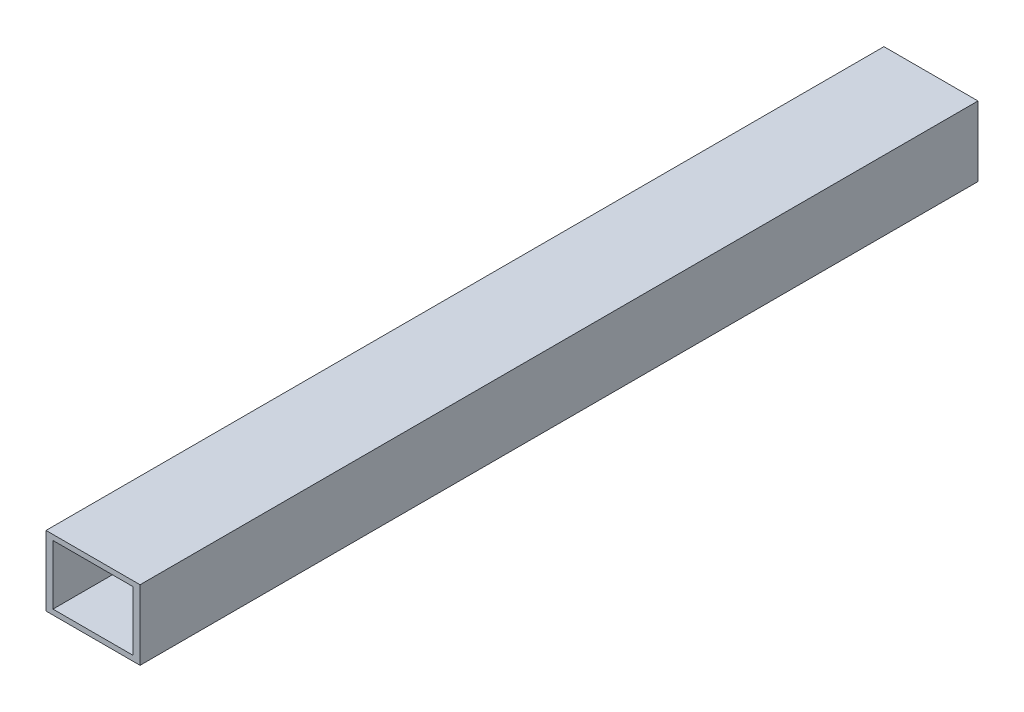
ISO-10303-21;
HEADER;
FILE_DESCRIPTION(('STEP AP214'),'2;1');
FILE_NAME('part.step','',(''),(''),'','','');
FILE_SCHEMA(('AUTOMOTIVE_DESIGN { 1 0 10303 214 1 1 1 1 }'));
ENDSEC;
DATA;
#1=APPLICATION_CONTEXT('core data for automotive mechanical design processes');
#2=APPLICATION_PROTOCOL_DEFINITION('international standard','automotive_design',2000,#1);
#3=PRODUCT_CONTEXT('',#1,'mechanical');
#4=PRODUCT('Part','Part','',(#3));
#5=PRODUCT_RELATED_PRODUCT_CATEGORY('part','',(#4));
#6=PRODUCT_DEFINITION_FORMATION('','',#4);
#7=PRODUCT_DEFINITION_CONTEXT('part definition',#1,'design');
#8=PRODUCT_DEFINITION('design','',#6,#7);
#9=PRODUCT_DEFINITION_SHAPE('','',#8);
#10=(LENGTH_UNIT() NAMED_UNIT(*) SI_UNIT(.MILLI.,.METRE.));
#11=(NAMED_UNIT(*) PLANE_ANGLE_UNIT() SI_UNIT($,.RADIAN.));
#12=(NAMED_UNIT(*) SI_UNIT($,.STERADIAN.) SOLID_ANGLE_UNIT());
#13=UNCERTAINTY_MEASURE_WITH_UNIT(LENGTH_MEASURE(1.E-05),#10,'distance_accuracy_value','');
#14=(GEOMETRIC_REPRESENTATION_CONTEXT(3) GLOBAL_UNCERTAINTY_ASSIGNED_CONTEXT((#13)) GLOBAL_UNIT_ASSIGNED_CONTEXT((#10,
#11,#12)) REPRESENTATION_CONTEXT('',''));
#15=CARTESIAN_POINT('',(0.,0.,0.));
#16=DIRECTION('',(0.,0.,1.));
#17=DIRECTION('',(1.,0.,0.));
#18=AXIS2_PLACEMENT_3D('',#15,#16,#17);
#19=CARTESIAN_POINT('',(0.,0.,609.6));
#20=DIRECTION('',(0.,0.,-1.));
#21=DIRECTION('',(-1.,0.,0.));
#22=AXIS2_PLACEMENT_3D('',#19,#20,#21);
#23=PLANE('',#22);
#24=DIRECTION('',(0.,1.,0.));
#25=VECTOR('',#24,1.);
#26=CARTESIAN_POINT('',(34.2141182707811,-25.4,609.6));
#27=LINE('',#26,#25);
#28=CARTESIAN_POINT('',(34.2141182707811,-25.4,609.6));
#29=VERTEX_POINT('',#28);
#30=CARTESIAN_POINT('',(34.2141182707811,25.4,609.6));
#31=VERTEX_POINT('',#30);
#32=EDGE_CURVE('E134',#29,#31,#27,.T.);
#33=ORIENTED_EDGE('',*,*,#32,.T.);
#34=DIRECTION('',(-1.,0.,0.));
#35=VECTOR('',#34,1.);
#36=CARTESIAN_POINT('',(-34.2141182707811,25.4,609.6));
#37=LINE('',#36,#35);
#38=CARTESIAN_POINT('',(-34.2141182707811,25.4,609.6));
#39=VERTEX_POINT('',#38);
#40=EDGE_CURVE('E137',#31,#39,#37,.T.);
#41=ORIENTED_EDGE('',*,*,#40,.T.);
#42=DIRECTION('',(0.,-1.,0.));
#43=VECTOR('',#42,1.);
#44=CARTESIAN_POINT('',(-34.2141182707811,-25.4,609.6));
#45=LINE('',#44,#43);
#46=CARTESIAN_POINT('',(-34.2141182707811,-25.4,609.6));
#47=VERTEX_POINT('',#46);
#48=EDGE_CURVE('E140',#39,#47,#45,.T.);
#49=ORIENTED_EDGE('',*,*,#48,.T.);
#50=DIRECTION('',(1.,0.,0.));
#51=VECTOR('',#50,1.);
#52=CARTESIAN_POINT('',(-34.2141182707811,-25.4,609.6));
#53=LINE('',#52,#51);
#54=EDGE_CURVE('E142',#47,#29,#53,.T.);
#55=ORIENTED_EDGE('',*,*,#54,.T.);
#56=EDGE_LOOP('',(#33,#41,#49,#55));
#57=FACE_BOUND('',#56,.T.);
#58=DIRECTION('',(0.,1.,0.));
#59=VECTOR('',#58,1.);
#60=CARTESIAN_POINT('',(29.1341182707811,-21.6286913554574,609.6));
#61=LINE('',#60,#59);
#62=CARTESIAN_POINT('',(29.1341182707811,-21.6286913554574,609.6));
#63=VERTEX_POINT('',#62);
#64=CARTESIAN_POINT('',(29.1341182707811,21.6286913554574,609.6));
#65=VERTEX_POINT('',#64);
#66=EDGE_CURVE('E98',#63,#65,#61,.T.);
#67=ORIENTED_EDGE('',*,*,#66,.F.);
#68=DIRECTION('',(1.,0.,0.));
#69=VECTOR('',#68,1.);
#70=CARTESIAN_POINT('',(-29.1341182707811,-21.6286913554574,609.6));
#71=LINE('',#70,#69);
#72=CARTESIAN_POINT('',(-29.1341182707811,-21.6286913554574,609.6));
#73=VERTEX_POINT('',#72);
#74=EDGE_CURVE('E120',#73,#63,#71,.T.);
#75=ORIENTED_EDGE('',*,*,#74,.F.);
#76=DIRECTION('',(0.,-1.,0.));
#77=VECTOR('',#76,1.);
#78=CARTESIAN_POINT('',(-29.1341182707811,-21.6286913554574,609.6));
#79=LINE('',#78,#77);
#80=CARTESIAN_POINT('',(-29.1341182707811,21.6286913554574,609.6));
#81=VERTEX_POINT('',#80);
#82=EDGE_CURVE('E118',#81,#73,#79,.T.);
#83=ORIENTED_EDGE('',*,*,#82,.F.);
#84=DIRECTION('',(-1.,0.,0.));
#85=VECTOR('',#84,1.);
#86=CARTESIAN_POINT('',(-29.1341182707811,21.6286913554574,609.6));
#87=LINE('',#86,#85);
#88=EDGE_CURVE('E106',#65,#81,#87,.T.);
#89=ORIENTED_EDGE('',*,*,#88,.F.);
#90=EDGE_LOOP('',(#67,#75,#83,#89));
#91=FACE_BOUND('',#90,.T.);
#92=ADVANCED_FACE('F33',(#57,#91),#23,.F.);
#93=CARTESIAN_POINT('',(0.,0.,0.));
#94=DIRECTION('',(0.,0.,-1.));
#95=DIRECTION('',(-1.,0.,0.));
#96=AXIS2_PLACEMENT_3D('',#93,#94,#95);
#97=PLANE('',#96);
#98=DIRECTION('',(0.,1.,0.));
#99=VECTOR('',#98,1.);
#100=CARTESIAN_POINT('',(34.2141182707811,-25.4,0.));
#101=LINE('',#100,#99);
#102=CARTESIAN_POINT('',(34.2141182707811,-25.4,0.));
#103=VERTEX_POINT('',#102);
#104=CARTESIAN_POINT('',(34.2141182707811,25.4,0.));
#105=VERTEX_POINT('',#104);
#106=EDGE_CURVE('E114',#103,#105,#101,.T.);
#107=ORIENTED_EDGE('',*,*,#106,.F.);
#108=DIRECTION('',(1.,0.,0.));
#109=VECTOR('',#108,1.);
#110=CARTESIAN_POINT('',(-34.2141182707811,-25.4,0.));
#111=LINE('',#110,#109);
#112=CARTESIAN_POINT('',(-34.2141182707811,-25.4,0.));
#113=VERTEX_POINT('',#112);
#114=EDGE_CURVE('E138',#113,#103,#111,.T.);
#115=ORIENTED_EDGE('',*,*,#114,.F.);
#116=DIRECTION('',(0.,-1.,0.));
#117=VECTOR('',#116,1.);
#118=CARTESIAN_POINT('',(-34.2141182707811,-25.4,0.));
#119=LINE('',#118,#117);
#120=CARTESIAN_POINT('',(-34.2141182707811,25.4,0.));
#121=VERTEX_POINT('',#120);
#122=EDGE_CURVE('E149',#121,#113,#119,.T.);
#123=ORIENTED_EDGE('',*,*,#122,.F.);
#124=DIRECTION('',(-1.,0.,0.));
#125=VECTOR('',#124,1.);
#126=CARTESIAN_POINT('',(-34.2141182707811,25.4,0.));
#127=LINE('',#126,#125);
#128=EDGE_CURVE('E147',#105,#121,#127,.T.);
#129=ORIENTED_EDGE('',*,*,#128,.F.);
#130=EDGE_LOOP('',(#107,#115,#123,#129));
#131=FACE_BOUND('',#130,.T.);
#132=DIRECTION('',(1.,0.,0.));
#133=VECTOR('',#132,1.);
#134=CARTESIAN_POINT('',(-29.1341182707811,-21.6286913554574,0.));
#135=LINE('',#134,#133);
#136=CARTESIAN_POINT('',(-29.1341182707811,-21.6286913554574,0.));
#137=VERTEX_POINT('',#136);
#138=CARTESIAN_POINT('',(29.1341182707811,-21.6286913554574,0.));
#139=VERTEX_POINT('',#138);
#140=EDGE_CURVE('E107',#137,#139,#135,.T.);
#141=ORIENTED_EDGE('',*,*,#140,.T.);
#142=DIRECTION('',(0.,1.,0.));
#143=VECTOR('',#142,1.);
#144=CARTESIAN_POINT('',(29.1341182707811,-21.6286913554574,0.));
#145=LINE('',#144,#143);
#146=CARTESIAN_POINT('',(29.1341182707811,21.6286913554574,0.));
#147=VERTEX_POINT('',#146);
#148=EDGE_CURVE('E56',#139,#147,#145,.T.);
#149=ORIENTED_EDGE('',*,*,#148,.T.);
#150=DIRECTION('',(-1.,0.,0.));
#151=VECTOR('',#150,1.);
#152=CARTESIAN_POINT('',(-29.1341182707811,21.6286913554574,0.));
#153=LINE('',#152,#151);
#154=CARTESIAN_POINT('',(-29.1341182707811,21.6286913554574,0.));
#155=VERTEX_POINT('',#154);
#156=EDGE_CURVE('E113',#147,#155,#153,.T.);
#157=ORIENTED_EDGE('',*,*,#156,.T.);
#158=DIRECTION('',(0.,-1.,0.));
#159=VECTOR('',#158,1.);
#160=CARTESIAN_POINT('',(-29.1341182707811,-21.6286913554574,0.));
#161=LINE('',#160,#159);
#162=EDGE_CURVE('E126',#155,#137,#161,.T.);
#163=ORIENTED_EDGE('',*,*,#162,.T.);
#164=EDGE_LOOP('',(#141,#149,#157,#163));
#165=FACE_BOUND('',#164,.T.);
#166=ADVANCED_FACE('F167',(#131,#165),#97,.T.);
#167=CARTESIAN_POINT('',(34.2141182707811,-25.4,609.6));
#168=DIRECTION('',(-1.,0.,0.));
#169=DIRECTION('',(0.,0.,1.));
#170=AXIS2_PLACEMENT_3D('',#167,#168,#169);
#171=PLANE('',#170);
#172=ORIENTED_EDGE('',*,*,#106,.T.);
#173=DIRECTION('',(0.,0.,-1.));
#174=VECTOR('',#173,1.);
#175=CARTESIAN_POINT('',(34.2141182707811,25.4,609.6));
#176=LINE('',#175,#174);
#177=EDGE_CURVE('E11',#31,#105,#176,.T.);
#178=ORIENTED_EDGE('',*,*,#177,.F.);
#179=ORIENTED_EDGE('',*,*,#32,.F.);
#180=DIRECTION('',(0.,0.,-1.));
#181=VECTOR('',#180,1.);
#182=CARTESIAN_POINT('',(34.2141182707811,-25.4,609.6));
#183=LINE('',#182,#181);
#184=EDGE_CURVE('E144',#29,#103,#183,.T.);
#185=ORIENTED_EDGE('',*,*,#184,.T.);
#186=EDGE_LOOP('',(#172,#178,#179,#185));
#187=FACE_BOUND('',#186,.T.);
#188=ADVANCED_FACE('F35',(#187),#171,.F.);
#189=CARTESIAN_POINT('',(-34.2141182707811,25.4,609.6));
#190=DIRECTION('',(0.,-1.,0.));
#191=DIRECTION('',(0.,0.,-1.));
#192=AXIS2_PLACEMENT_3D('',#189,#190,#191);
#193=PLANE('',#192);
#194=ORIENTED_EDGE('',*,*,#128,.T.);
#195=DIRECTION('',(0.,0.,-1.));
#196=VECTOR('',#195,1.);
#197=CARTESIAN_POINT('',(-34.2141182707811,25.4,609.6));
#198=LINE('',#197,#196);
#199=EDGE_CURVE('E41',#39,#121,#198,.T.);
#200=ORIENTED_EDGE('',*,*,#199,.F.);
#201=ORIENTED_EDGE('',*,*,#40,.F.);
#202=ORIENTED_EDGE('',*,*,#177,.T.);
#203=EDGE_LOOP('',(#194,#200,#201,#202));
#204=FACE_BOUND('',#203,.T.);
#205=ADVANCED_FACE('F177',(#204),#193,.F.);
#206=CARTESIAN_POINT('',(-34.2141182707811,-25.4,609.6));
#207=DIRECTION('',(1.,0.,0.));
#208=DIRECTION('',(0.,1.,0.));
#209=AXIS2_PLACEMENT_3D('',#206,#207,#208);
#210=PLANE('',#209);
#211=ORIENTED_EDGE('',*,*,#122,.T.);
#212=DIRECTION('',(0.,0.,-1.));
#213=VECTOR('',#212,1.);
#214=CARTESIAN_POINT('',(-34.2141182707811,-25.4,609.6));
#215=LINE('',#214,#213);
#216=EDGE_CURVE('E154',#47,#113,#215,.T.);
#217=ORIENTED_EDGE('',*,*,#216,.F.);
#218=ORIENTED_EDGE('',*,*,#48,.F.);
#219=ORIENTED_EDGE('',*,*,#199,.T.);
#220=EDGE_LOOP('',(#211,#217,#218,#219));
#221=FACE_BOUND('',#220,.T.);
#222=ADVANCED_FACE('F161',(#221),#210,.F.);
#223=CARTESIAN_POINT('',(-34.2141182707811,-25.4,609.6));
#224=DIRECTION('',(0.,1.,0.));
#225=DIRECTION('',(0.,0.,1.));
#226=AXIS2_PLACEMENT_3D('',#223,#224,#225);
#227=PLANE('',#226);
#228=ORIENTED_EDGE('',*,*,#114,.T.);
#229=ORIENTED_EDGE('',*,*,#184,.F.);
#230=ORIENTED_EDGE('',*,*,#54,.F.);
#231=ORIENTED_EDGE('',*,*,#216,.T.);
#232=EDGE_LOOP('',(#228,#229,#230,#231));
#233=FACE_BOUND('',#232,.T.);
#234=ADVANCED_FACE('F171',(#233),#227,.F.);
#235=CARTESIAN_POINT('',(29.1341182707811,-21.6286913554574,609.6));
#236=DIRECTION('',(-1.,0.,0.));
#237=DIRECTION('',(0.,0.,1.));
#238=AXIS2_PLACEMENT_3D('',#235,#236,#237);
#239=PLANE('',#238);
#240=ORIENTED_EDGE('',*,*,#148,.F.);
#241=DIRECTION('',(0.,0.,-1.));
#242=VECTOR('',#241,1.);
#243=CARTESIAN_POINT('',(29.1341182707811,-21.6286913554574,609.6));
#244=LINE('',#243,#242);
#245=EDGE_CURVE('E102',#63,#139,#244,.T.);
#246=ORIENTED_EDGE('',*,*,#245,.F.);
#247=ORIENTED_EDGE('',*,*,#66,.T.);
#248=DIRECTION('',(0.,0.,-1.));
#249=VECTOR('',#248,1.);
#250=CARTESIAN_POINT('',(29.1341182707811,21.6286913554574,609.6));
#251=LINE('',#250,#249);
#252=EDGE_CURVE('E101',#65,#147,#251,.T.);
#253=ORIENTED_EDGE('',*,*,#252,.T.);
#254=EDGE_LOOP('',(#240,#246,#247,#253));
#255=FACE_BOUND('',#254,.T.);
#256=ADVANCED_FACE('F100',(#255),#239,.T.);
#257=CARTESIAN_POINT('',(-29.1341182707811,21.6286913554574,609.6));
#258=DIRECTION('',(0.,-1.,0.));
#259=DIRECTION('',(1.,0.,0.));
#260=AXIS2_PLACEMENT_3D('',#257,#258,#259);
#261=PLANE('',#260);
#262=ORIENTED_EDGE('',*,*,#156,.F.);
#263=ORIENTED_EDGE('',*,*,#252,.F.);
#264=ORIENTED_EDGE('',*,*,#88,.T.);
#265=DIRECTION('',(0.,0.,-1.));
#266=VECTOR('',#265,1.);
#267=CARTESIAN_POINT('',(-29.1341182707811,21.6286913554574,609.6));
#268=LINE('',#267,#266);
#269=EDGE_CURVE('E115',#81,#155,#268,.T.);
#270=ORIENTED_EDGE('',*,*,#269,.T.);
#271=EDGE_LOOP('',(#262,#263,#264,#270));
#272=FACE_BOUND('',#271,.T.);
#273=ADVANCED_FACE('F110',(#272),#261,.T.);
#274=CARTESIAN_POINT('',(-29.1341182707811,-21.6286913554574,609.6));
#275=DIRECTION('',(1.,0.,0.));
#276=DIRECTION('',(0.,1.,0.));
#277=AXIS2_PLACEMENT_3D('',#274,#275,#276);
#278=PLANE('',#277);
#279=ORIENTED_EDGE('',*,*,#162,.F.);
#280=ORIENTED_EDGE('',*,*,#269,.F.);
#281=ORIENTED_EDGE('',*,*,#82,.T.);
#282=DIRECTION('',(0.,0.,-1.));
#283=VECTOR('',#282,1.);
#284=CARTESIAN_POINT('',(-29.1341182707811,-21.6286913554574,609.6));
#285=LINE('',#284,#283);
#286=EDGE_CURVE('E48',#73,#137,#285,.T.);
#287=ORIENTED_EDGE('',*,*,#286,.T.);
#288=EDGE_LOOP('',(#279,#280,#281,#287));
#289=FACE_BOUND('',#288,.T.);
#290=ADVANCED_FACE('F200',(#289),#278,.T.);
#291=CARTESIAN_POINT('',(-29.1341182707811,-21.6286913554574,609.6));
#292=DIRECTION('',(0.,1.,0.));
#293=DIRECTION('',(0.,0.,1.));
#294=AXIS2_PLACEMENT_3D('',#291,#292,#293);
#295=PLANE('',#294);
#296=ORIENTED_EDGE('',*,*,#140,.F.);
#297=ORIENTED_EDGE('',*,*,#286,.F.);
#298=ORIENTED_EDGE('',*,*,#74,.T.);
#299=ORIENTED_EDGE('',*,*,#245,.T.);
#300=EDGE_LOOP('',(#296,#297,#298,#299));
#301=FACE_BOUND('',#300,.T.);
#302=ADVANCED_FACE('F204',(#301),#295,.T.);
#303=CLOSED_SHELL('',(#92,#166,#188,#205,#222,#234,#256,#273,#290,#302));
#304=MANIFOLD_SOLID_BREP('B2',#303);
#305=ADVANCED_BREP_SHAPE_REPRESENTATION('',(#18,#304),#14);
#306=SHAPE_DEFINITION_REPRESENTATION(#9,#305);
ENDSEC;
END-ISO-10303-21;
